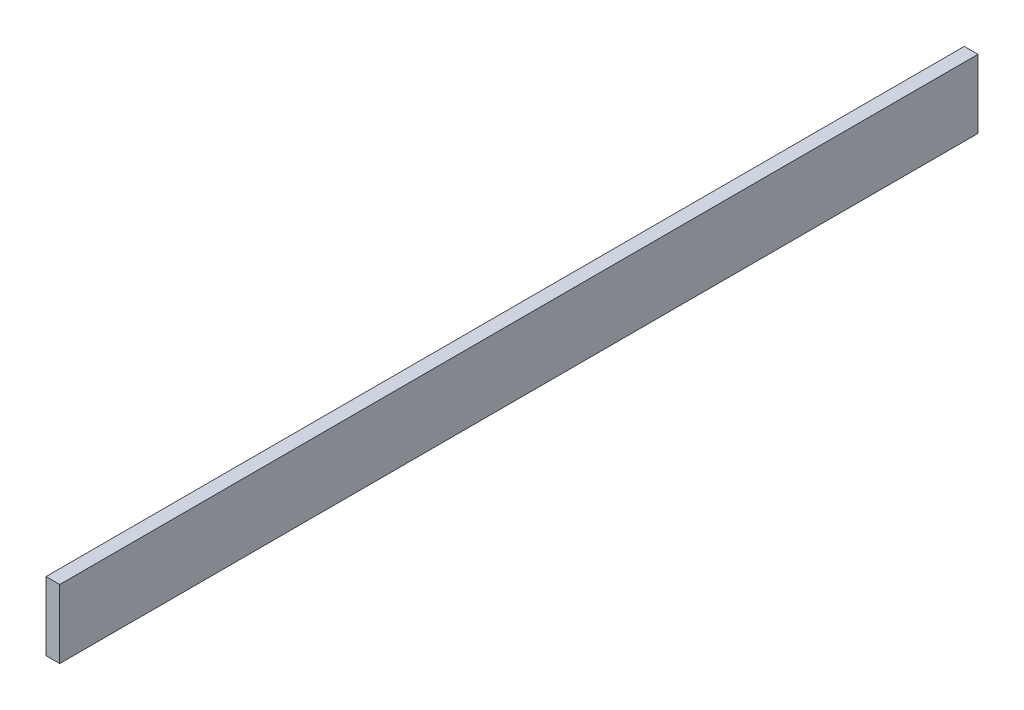
ISO-10303-21;
HEADER;
FILE_DESCRIPTION(('STEP AP214'),'2;1');
FILE_NAME('part.step','',(''),(''),'','','');
FILE_SCHEMA(('AUTOMOTIVE_DESIGN { 1 0 10303 214 1 1 1 1 }'));
ENDSEC;
DATA;
#1=APPLICATION_CONTEXT('core data for automotive mechanical design processes');
#2=APPLICATION_PROTOCOL_DEFINITION('international standard','automotive_design',2000,#1);
#3=PRODUCT_CONTEXT('',#1,'mechanical');
#4=PRODUCT('Part','Part','',(#3));
#5=PRODUCT_RELATED_PRODUCT_CATEGORY('part','',(#4));
#6=PRODUCT_DEFINITION_FORMATION('','',#4);
#7=PRODUCT_DEFINITION_CONTEXT('part definition',#1,'design');
#8=PRODUCT_DEFINITION('design','',#6,#7);
#9=PRODUCT_DEFINITION_SHAPE('','',#8);
#10=(LENGTH_UNIT() NAMED_UNIT(*) SI_UNIT(.MILLI.,.METRE.));
#11=(NAMED_UNIT(*) PLANE_ANGLE_UNIT() SI_UNIT($,.RADIAN.));
#12=(NAMED_UNIT(*) SI_UNIT($,.STERADIAN.) SOLID_ANGLE_UNIT());
#13=UNCERTAINTY_MEASURE_WITH_UNIT(LENGTH_MEASURE(1.E-05),#10,'distance_accuracy_value','');
#14=(GEOMETRIC_REPRESENTATION_CONTEXT(3) GLOBAL_UNCERTAINTY_ASSIGNED_CONTEXT((#13)) GLOBAL_UNIT_ASSIGNED_CONTEXT((#10,
#11,#12)) REPRESENTATION_CONTEXT('',''));
#15=CARTESIAN_POINT('',(0.,0.,0.));
#16=DIRECTION('',(0.,0.,1.));
#17=DIRECTION('',(1.,0.,0.));
#18=AXIS2_PLACEMENT_3D('',#15,#16,#17);
#19=CARTESIAN_POINT('',(0.,10.,-2.));
#20=DIRECTION('',(0.,0.,-1.));
#21=DIRECTION('',(-1.,0.,0.));
#22=AXIS2_PLACEMENT_3D('',#19,#20,#21);
#23=PLANE('',#22);
#24=DIRECTION('',(1.,0.,0.));
#25=VECTOR('',#24,1.);
#26=CARTESIAN_POINT('',(0.,0.,-2.));
#27=LINE('',#26,#25);
#28=CARTESIAN_POINT('',(10.,0.,-2.));
#29=VERTEX_POINT('',#28);
#30=CARTESIAN_POINT('',(12.,0.,-2.));
#31=VERTEX_POINT('',#30);
#32=EDGE_CURVE('E106',#29,#31,#27,.T.);
#33=ORIENTED_EDGE('',*,*,#32,.F.);
#34=DIRECTION('',(0.,-1.,0.));
#35=VECTOR('',#34,1.);
#36=CARTESIAN_POINT('',(10.,10.,-2.));
#37=LINE('',#36,#35);
#38=CARTESIAN_POINT('',(10.,10.,-2.));
#39=VERTEX_POINT('',#38);
#40=EDGE_CURVE('E11',#39,#29,#37,.T.);
#41=ORIENTED_EDGE('',*,*,#40,.F.);
#42=DIRECTION('',(1.,0.,0.));
#43=VECTOR('',#42,1.);
#44=CARTESIAN_POINT('',(0.,10.,-2.));
#45=LINE('',#44,#43);
#46=CARTESIAN_POINT('',(12.,10.,-2.));
#47=VERTEX_POINT('',#46);
#48=EDGE_CURVE('E91',#39,#47,#45,.T.);
#49=ORIENTED_EDGE('',*,*,#48,.T.);
#50=DIRECTION('',(0.,-1.,0.));
#51=VECTOR('',#50,1.);
#52=CARTESIAN_POINT('',(12.,10.,-2.));
#53=LINE('',#52,#51);
#54=EDGE_CURVE('E59',#47,#31,#53,.T.);
#55=ORIENTED_EDGE('',*,*,#54,.T.);
#56=EDGE_LOOP('',(#33,#41,#49,#55));
#57=FACE_BOUND('',#56,.T.);
#58=ADVANCED_FACE('F43',(#57),#23,.T.);
#59=CARTESIAN_POINT('',(10.,10.,0.));
#60=DIRECTION('',(1.,0.,0.));
#61=DIRECTION('',(0.,0.,-1.));
#62=AXIS2_PLACEMENT_3D('',#59,#60,#61);
#63=PLANE('',#62);
#64=DIRECTION('',(0.,0.,1.));
#65=VECTOR('',#64,1.);
#66=CARTESIAN_POINT('',(10.,0.,0.));
#67=LINE('',#66,#65);
#68=CARTESIAN_POINT('',(10.,0.,132.));
#69=VERTEX_POINT('',#68);
#70=EDGE_CURVE('E97',#29,#69,#67,.T.);
#71=ORIENTED_EDGE('',*,*,#70,.T.);
#72=DIRECTION('',(0.,-1.,0.));
#73=VECTOR('',#72,1.);
#74=CARTESIAN_POINT('',(10.,10.,132.));
#75=LINE('',#74,#73);
#76=CARTESIAN_POINT('',(10.,10.,132.));
#77=VERTEX_POINT('',#76);
#78=EDGE_CURVE('E51',#77,#69,#75,.T.);
#79=ORIENTED_EDGE('',*,*,#78,.F.);
#80=DIRECTION('',(0.,0.,1.));
#81=VECTOR('',#80,1.);
#82=CARTESIAN_POINT('',(10.,10.,0.));
#83=LINE('',#82,#81);
#84=EDGE_CURVE('E85',#39,#77,#83,.T.);
#85=ORIENTED_EDGE('',*,*,#84,.F.);
#86=ORIENTED_EDGE('',*,*,#40,.T.);
#87=EDGE_LOOP('',(#71,#79,#85,#86));
#88=FACE_BOUND('',#87,.T.);
#89=ADVANCED_FACE('F95',(#88),#63,.F.);
#90=CARTESIAN_POINT('',(0.,10.,132.));
#91=DIRECTION('',(0.,0.,-1.));
#92=DIRECTION('',(-1.,0.,0.));
#93=AXIS2_PLACEMENT_3D('',#90,#91,#92);
#94=PLANE('',#93);
#95=DIRECTION('',(1.,0.,0.));
#96=VECTOR('',#95,1.);
#97=CARTESIAN_POINT('',(0.,0.,132.));
#98=LINE('',#97,#96);
#99=CARTESIAN_POINT('',(12.,0.,132.));
#100=VERTEX_POINT('',#99);
#101=EDGE_CURVE('E109',#69,#100,#98,.T.);
#102=ORIENTED_EDGE('',*,*,#101,.T.);
#103=DIRECTION('',(0.,-1.,0.));
#104=VECTOR('',#103,1.);
#105=CARTESIAN_POINT('',(12.,10.,132.));
#106=LINE('',#105,#104);
#107=CARTESIAN_POINT('',(12.,10.,132.));
#108=VERTEX_POINT('',#107);
#109=EDGE_CURVE('E73',#108,#100,#106,.T.);
#110=ORIENTED_EDGE('',*,*,#109,.F.);
#111=DIRECTION('',(1.,0.,0.));
#112=VECTOR('',#111,1.);
#113=CARTESIAN_POINT('',(0.,10.,132.));
#114=LINE('',#113,#112);
#115=EDGE_CURVE('E90',#77,#108,#114,.T.);
#116=ORIENTED_EDGE('',*,*,#115,.F.);
#117=ORIENTED_EDGE('',*,*,#78,.T.);
#118=EDGE_LOOP('',(#102,#110,#116,#117));
#119=FACE_BOUND('',#118,.T.);
#120=ADVANCED_FACE('F100',(#119),#94,.F.);
#121=CARTESIAN_POINT('',(12.,10.,0.));
#122=DIRECTION('',(1.,0.,0.));
#123=DIRECTION('',(0.,0.,-1.));
#124=AXIS2_PLACEMENT_3D('',#121,#122,#123);
#125=PLANE('',#124);
#126=DIRECTION('',(0.,0.,1.));
#127=VECTOR('',#126,1.);
#128=CARTESIAN_POINT('',(12.,0.,0.));
#129=LINE('',#128,#127);
#130=EDGE_CURVE('E111',#31,#100,#129,.T.);
#131=ORIENTED_EDGE('',*,*,#130,.F.);
#132=ORIENTED_EDGE('',*,*,#54,.F.);
#133=DIRECTION('',(0.,0.,1.));
#134=VECTOR('',#133,1.);
#135=CARTESIAN_POINT('',(12.,10.,0.));
#136=LINE('',#135,#134);
#137=EDGE_CURVE('E101',#47,#108,#136,.T.);
#138=ORIENTED_EDGE('',*,*,#137,.T.);
#139=ORIENTED_EDGE('',*,*,#109,.T.);
#140=EDGE_LOOP('',(#131,#132,#138,#139));
#141=FACE_BOUND('',#140,.T.);
#142=ADVANCED_FACE('F116',(#141),#125,.T.);
#143=CARTESIAN_POINT('',(0.,10.,0.));
#144=DIRECTION('',(0.,1.,0.));
#145=DIRECTION('',(0.,0.,1.));
#146=AXIS2_PLACEMENT_3D('',#143,#144,#145);
#147=PLANE('',#146);
#148=ORIENTED_EDGE('',*,*,#48,.F.);
#149=ORIENTED_EDGE('',*,*,#84,.T.);
#150=ORIENTED_EDGE('',*,*,#115,.T.);
#151=ORIENTED_EDGE('',*,*,#137,.F.);
#152=EDGE_LOOP('',(#148,#149,#150,#151));
#153=FACE_BOUND('',#152,.T.);
#154=ADVANCED_FACE('F87',(#153),#147,.T.);
#155=CARTESIAN_POINT('',(0.,0.,0.));
#156=DIRECTION('',(0.,1.,0.));
#157=DIRECTION('',(0.,0.,1.));
#158=AXIS2_PLACEMENT_3D('',#155,#156,#157);
#159=PLANE('',#158);
#160=ORIENTED_EDGE('',*,*,#32,.T.);
#161=ORIENTED_EDGE('',*,*,#130,.T.);
#162=ORIENTED_EDGE('',*,*,#101,.F.);
#163=ORIENTED_EDGE('',*,*,#70,.F.);
#164=EDGE_LOOP('',(#160,#161,#162,#163));
#165=FACE_BOUND('',#164,.T.);
#166=ADVANCED_FACE('F123',(#165),#159,.F.);
#167=CLOSED_SHELL('',(#58,#89,#120,#142,#154,#166));
#168=MANIFOLD_SOLID_BREP('B2',#167);
#169=ADVANCED_BREP_SHAPE_REPRESENTATION('',(#18,#168),#14);
#170=SHAPE_DEFINITION_REPRESENTATION(#9,#169);
ENDSEC;
END-ISO-10303-21;
